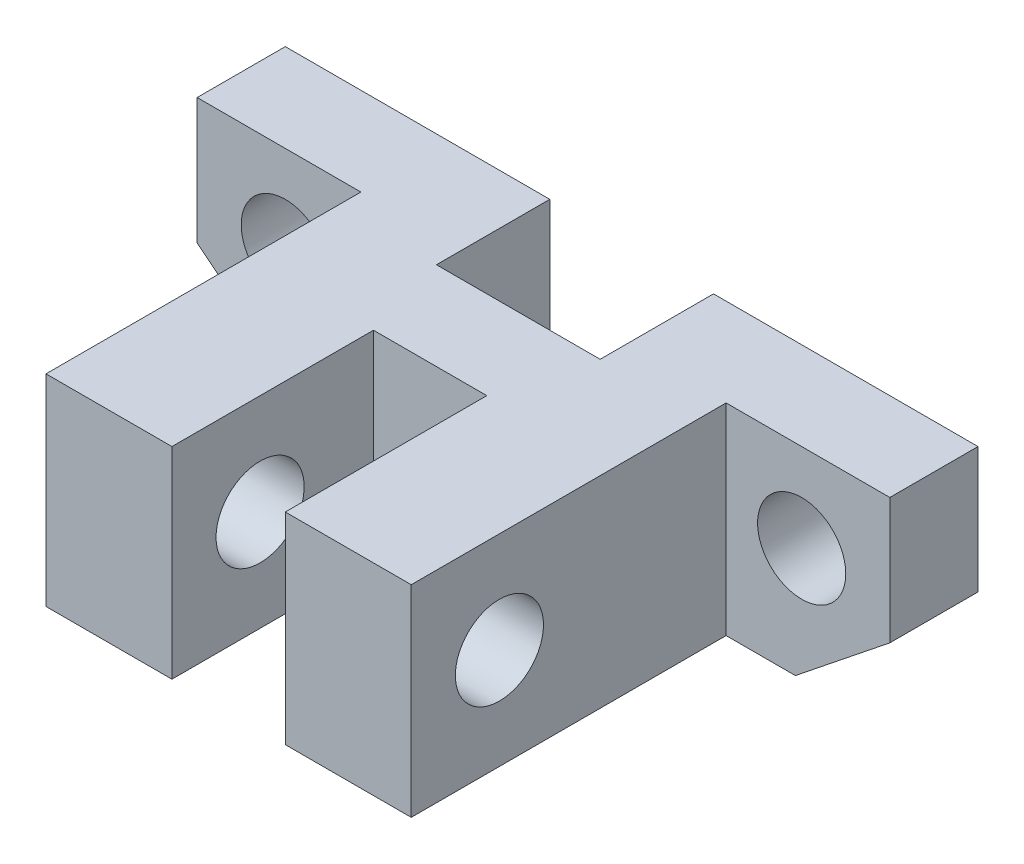
ISO-10303-21;
HEADER;
FILE_DESCRIPTION(('STEP AP214'),'2;1');
FILE_NAME('part.step','',(''),(''),'','','');
FILE_SCHEMA(('AUTOMOTIVE_DESIGN { 1 0 10303 214 1 1 1 1 }'));
ENDSEC;
DATA;
#1=APPLICATION_CONTEXT('core data for automotive mechanical design processes');
#2=APPLICATION_PROTOCOL_DEFINITION('international standard','automotive_design',2000,#1);
#3=PRODUCT_CONTEXT('',#1,'mechanical');
#4=PRODUCT('Part','Part','',(#3));
#5=PRODUCT_RELATED_PRODUCT_CATEGORY('part','',(#4));
#6=PRODUCT_DEFINITION_FORMATION('','',#4);
#7=PRODUCT_DEFINITION_CONTEXT('part definition',#1,'design');
#8=PRODUCT_DEFINITION('design','',#6,#7);
#9=PRODUCT_DEFINITION_SHAPE('','',#8);
#10=(LENGTH_UNIT() NAMED_UNIT(*) SI_UNIT(.MILLI.,.METRE.));
#11=(NAMED_UNIT(*) PLANE_ANGLE_UNIT() SI_UNIT($,.RADIAN.));
#12=(NAMED_UNIT(*) SI_UNIT($,.STERADIAN.) SOLID_ANGLE_UNIT());
#13=UNCERTAINTY_MEASURE_WITH_UNIT(LENGTH_MEASURE(1.E-05),#10,'distance_accuracy_value','');
#14=(GEOMETRIC_REPRESENTATION_CONTEXT(3) GLOBAL_UNCERTAINTY_ASSIGNED_CONTEXT((#13)) GLOBAL_UNIT_ASSIGNED_CONTEXT((#10,
#11,#12)) REPRESENTATION_CONTEXT('',''));
#15=CARTESIAN_POINT('',(0.,0.,0.));
#16=DIRECTION('',(0.,0.,1.));
#17=DIRECTION('',(1.,0.,0.));
#18=AXIS2_PLACEMENT_3D('',#15,#16,#17);
#19=CARTESIAN_POINT('',(0.,0.,32.));
#20=DIRECTION('',(0.,0.,1.));
#21=DIRECTION('',(1.,0.,0.));
#22=AXIS2_PLACEMENT_3D('',#19,#20,#21);
#23=PLANE('',#22);
#24=DIRECTION('',(0.,1.,0.));
#25=VECTOR('',#24,1.);
#26=CARTESIAN_POINT('',(4.5,0.,32.));
#27=LINE('',#26,#25);
#28=CARTESIAN_POINT('',(4.5,-11.,32.));
#29=VERTEX_POINT('',#28);
#30=CARTESIAN_POINT('',(4.5,5.,32.));
#31=VERTEX_POINT('',#30);
#32=EDGE_CURVE('E210',#29,#31,#27,.T.);
#33=ORIENTED_EDGE('',*,*,#32,.F.);
#34=DIRECTION('',(1.,0.,0.));
#35=VECTOR('',#34,1.);
#36=CARTESIAN_POINT('',(-20.,-11.,32.));
#37=LINE('',#36,#35);
#38=CARTESIAN_POINT('',(14.5,-11.,32.));
#39=VERTEX_POINT('',#38);
#40=EDGE_CURVE('E294',#29,#39,#37,.T.);
#41=ORIENTED_EDGE('',*,*,#40,.T.);
#42=DIRECTION('',(0.,1.,0.));
#43=VECTOR('',#42,1.);
#44=CARTESIAN_POINT('',(14.5,0.,32.));
#45=LINE('',#44,#43);
#46=CARTESIAN_POINT('',(14.5,5.,32.));
#47=VERTEX_POINT('',#46);
#48=EDGE_CURVE('E344',#39,#47,#45,.T.);
#49=ORIENTED_EDGE('',*,*,#48,.T.);
#50=DIRECTION('',(-1.,0.,0.));
#51=VECTOR('',#50,1.);
#52=CARTESIAN_POINT('',(-27.5,5.,32.));
#53=LINE('',#52,#51);
#54=EDGE_CURVE('E290',#47,#31,#53,.T.);
#55=ORIENTED_EDGE('',*,*,#54,.T.);
#56=EDGE_LOOP('',(#33,#41,#49,#55));
#57=FACE_BOUND('',#56,.T.);
#58=ADVANCED_FACE('F45',(#57),#23,.T.);
#59=CARTESIAN_POINT('',(0.,0.,0.));
#60=DIRECTION('',(0.,0.,1.));
#61=DIRECTION('',(1.,0.,0.));
#62=AXIS2_PLACEMENT_3D('',#59,#60,#61);
#63=PLANE('',#62);
#64=CARTESIAN_POINT('',(20.5,-2.,0.));
#65=DIRECTION('',(0.,0.,1.));
#66=DIRECTION('',(1.,0.,0.));
#67=AXIS2_PLACEMENT_3D('',#64,#65,#66);
#68=CIRCLE('',#67,3.5);
#69=CARTESIAN_POINT('',(24.,-2.,0.));
#70=VERTEX_POINT('',#69);
#71=EDGE_CURVE('E632',#70,#70,#68,.T.);
#72=ORIENTED_EDGE('',*,*,#71,.T.);
#73=EDGE_LOOP('',(#72));
#74=FACE_BOUND('',#73,.T.);
#75=DIRECTION('',(1.,0.,0.));
#76=VECTOR('',#75,1.);
#77=CARTESIAN_POINT('',(-20.,-11.,0.));
#78=LINE('',#77,#76);
#79=CARTESIAN_POINT('',(6.5,-11.,0.));
#80=VERTEX_POINT('',#79);
#81=CARTESIAN_POINT('',(20.,-11.,0.));
#82=VERTEX_POINT('',#81);
#83=EDGE_CURVE('E320',#80,#82,#78,.T.);
#84=ORIENTED_EDGE('',*,*,#83,.F.);
#85=DIRECTION('',(0.,-1.,0.));
#86=VECTOR('',#85,1.);
#87=CARTESIAN_POINT('',(6.5,5.,0.));
#88=LINE('',#87,#86);
#89=CARTESIAN_POINT('',(6.5,5.,0.));
#90=VERTEX_POINT('',#89);
#91=EDGE_CURVE('E236',#90,#80,#88,.T.);
#92=ORIENTED_EDGE('',*,*,#91,.F.);
#93=DIRECTION('',(-1.,0.,0.));
#94=VECTOR('',#93,1.);
#95=CARTESIAN_POINT('',(-27.5,5.,0.));
#96=LINE('',#95,#94);
#97=CARTESIAN_POINT('',(27.5,5.,0.));
#98=VERTEX_POINT('',#97);
#99=EDGE_CURVE('E308',#98,#90,#96,.T.);
#100=ORIENTED_EDGE('',*,*,#99,.F.);
#101=DIRECTION('',(0.,1.,0.));
#102=VECTOR('',#101,1.);
#103=CARTESIAN_POINT('',(27.5,5.,0.));
#104=LINE('',#103,#102);
#105=CARTESIAN_POINT('',(27.5,-5.,0.));
#106=VERTEX_POINT('',#105);
#107=EDGE_CURVE('E303',#106,#98,#104,.T.);
#108=ORIENTED_EDGE('',*,*,#107,.F.);
#109=DIRECTION('',(0.780868809443031,0.624695047554424,0.));
#110=VECTOR('',#109,1.);
#111=CARTESIAN_POINT('',(20.,-11.,0.));
#112=LINE('',#111,#110);
#113=EDGE_CURVE('E289',#82,#106,#112,.T.);
#114=ORIENTED_EDGE('',*,*,#113,.F.);
#115=EDGE_LOOP('',(#84,#92,#100,#108,#114));
#116=FACE_BOUND('',#115,.T.);
#117=ADVANCED_FACE('F387',(#74,#116),#63,.F.);
#118=DIRECTION('',(0.,-1.,0.));
#119=VECTOR('',#118,1.);
#120=CARTESIAN_POINT('',(-4.5,0.,32.));
#121=LINE('',#120,#119);
#122=CARTESIAN_POINT('',(-4.5,5.,32.));
#123=VERTEX_POINT('',#122);
#124=CARTESIAN_POINT('',(-4.5,-11.,32.));
#125=VERTEX_POINT('',#124);
#126=EDGE_CURVE('E62',#123,#125,#121,.T.);
#127=ORIENTED_EDGE('',*,*,#126,.F.);
#128=CARTESIAN_POINT('',(-14.5,5.,32.));
#129=VERTEX_POINT('',#128);
#130=EDGE_CURVE('E191',#123,#129,#53,.T.);
#131=ORIENTED_EDGE('',*,*,#130,.T.);
#132=DIRECTION('',(0.,-1.,0.));
#133=VECTOR('',#132,1.);
#134=CARTESIAN_POINT('',(-14.5,0.,32.));
#135=LINE('',#134,#133);
#136=CARTESIAN_POINT('',(-14.5,-11.,32.));
#137=VERTEX_POINT('',#136);
#138=EDGE_CURVE('E251',#129,#137,#135,.T.);
#139=ORIENTED_EDGE('',*,*,#138,.T.);
#140=EDGE_CURVE('E295',#137,#125,#37,.T.);
#141=ORIENTED_EDGE('',*,*,#140,.T.);
#142=EDGE_LOOP('',(#127,#131,#139,#141));
#143=FACE_BOUND('',#142,.T.);
#144=ADVANCED_FACE('F411',(#143),#23,.T.);
#145=CARTESIAN_POINT('',(20.,-11.,32.));
#146=DIRECTION('',(-0.624695047554424,0.780868809443031,0.));
#147=DIRECTION('',(-0.780868809443031,-0.624695047554424,0.));
#148=AXIS2_PLACEMENT_3D('',#145,#146,#147);
#149=PLANE('',#148);
#150=DIRECTION('',(0.,0.,-1.));
#151=VECTOR('',#150,1.);
#152=CARTESIAN_POINT('',(27.5,-5.,32.));
#153=LINE('',#152,#151);
#154=CARTESIAN_POINT('',(27.5,-5.,7.));
#155=VERTEX_POINT('',#154);
#156=EDGE_CURVE('E341',#155,#106,#153,.T.);
#157=ORIENTED_EDGE('',*,*,#156,.F.);
#158=DIRECTION('',(-0.780868809443031,-0.624695047554424,0.));
#159=VECTOR('',#158,1.);
#160=CARTESIAN_POINT('',(20.,-11.,6.99999999999999));
#161=LINE('',#160,#159);
#162=CARTESIAN_POINT('',(20.,-11.,7.));
#163=VERTEX_POINT('',#162);
#164=EDGE_CURVE('E281',#155,#163,#161,.T.);
#165=ORIENTED_EDGE('',*,*,#164,.T.);
#166=DIRECTION('',(0.,0.,-1.));
#167=VECTOR('',#166,1.);
#168=CARTESIAN_POINT('',(20.,-11.,32.));
#169=LINE('',#168,#167);
#170=EDGE_CURVE('E299',#163,#82,#169,.T.);
#171=ORIENTED_EDGE('',*,*,#170,.T.);
#172=ORIENTED_EDGE('',*,*,#113,.T.);
#173=EDGE_LOOP('',(#157,#165,#171,#172));
#174=FACE_BOUND('',#173,.T.);
#175=ADVANCED_FACE('F47',(#174),#149,.F.);
#176=CARTESIAN_POINT('',(27.5,5.,32.));
#177=DIRECTION('',(-1.,0.,0.));
#178=DIRECTION('',(0.,0.,1.));
#179=AXIS2_PLACEMENT_3D('',#176,#177,#178);
#180=PLANE('',#179);
#181=DIRECTION('',(0.,0.,-1.));
#182=VECTOR('',#181,1.);
#183=CARTESIAN_POINT('',(27.5,5.,32.));
#184=LINE('',#183,#182);
#185=CARTESIAN_POINT('',(27.5,5.,7.));
#186=VERTEX_POINT('',#185);
#187=EDGE_CURVE('E338',#186,#98,#184,.T.);
#188=ORIENTED_EDGE('',*,*,#187,.F.);
#189=DIRECTION('',(0.,1.,0.));
#190=VECTOR('',#189,1.);
#191=CARTESIAN_POINT('',(27.5,16.7277578085355,7.));
#192=LINE('',#191,#190);
#193=EDGE_CURVE('E268',#155,#186,#192,.T.);
#194=ORIENTED_EDGE('',*,*,#193,.F.);
#195=ORIENTED_EDGE('',*,*,#156,.T.);
#196=ORIENTED_EDGE('',*,*,#107,.T.);
#197=EDGE_LOOP('',(#188,#194,#195,#196));
#198=FACE_BOUND('',#197,.T.);
#199=ADVANCED_FACE('F394',(#198),#180,.F.);
#200=CARTESIAN_POINT('',(-27.5,5.,32.));
#201=DIRECTION('',(0.,-1.,0.));
#202=DIRECTION('',(0.,0.,-1.));
#203=AXIS2_PLACEMENT_3D('',#200,#201,#202);
#204=PLANE('',#203);
#205=DIRECTION('',(1.,0.,0.));
#206=VECTOR('',#205,1.);
#207=CARTESIAN_POINT('',(-4.5,5.,16.));
#208=LINE('',#207,#206);
#209=CARTESIAN_POINT('',(-4.5,5.,16.));
#210=VERTEX_POINT('',#209);
#211=CARTESIAN_POINT('',(4.5,5.,16.));
#212=VERTEX_POINT('',#211);
#213=EDGE_CURVE('E179',#210,#212,#208,.T.);
#214=ORIENTED_EDGE('',*,*,#213,.T.);
#215=DIRECTION('',(0.,0.,1.));
#216=VECTOR('',#215,1.);
#217=CARTESIAN_POINT('',(4.5,5.,16.));
#218=LINE('',#217,#216);
#219=EDGE_CURVE('E193',#212,#31,#218,.T.);
#220=ORIENTED_EDGE('',*,*,#219,.T.);
#221=ORIENTED_EDGE('',*,*,#54,.F.);
#222=DIRECTION('',(0.,0.,1.));
#223=VECTOR('',#222,1.);
#224=CARTESIAN_POINT('',(14.5,5.,32.));
#225=LINE('',#224,#223);
#226=CARTESIAN_POINT('',(14.5,5.,7.));
#227=VERTEX_POINT('',#226);
#228=EDGE_CURVE('E278',#227,#47,#225,.T.);
#229=ORIENTED_EDGE('',*,*,#228,.F.);
#230=DIRECTION('',(1.,0.,0.));
#231=VECTOR('',#230,1.);
#232=CARTESIAN_POINT('',(-27.5,5.,7.));
#233=LINE('',#232,#231);
#234=EDGE_CURVE('E285',#227,#186,#233,.T.);
#235=ORIENTED_EDGE('',*,*,#234,.T.);
#236=ORIENTED_EDGE('',*,*,#187,.T.);
#237=ORIENTED_EDGE('',*,*,#99,.T.);
#238=DIRECTION('',(0.,0.,1.));
#239=VECTOR('',#238,1.);
#240=CARTESIAN_POINT('',(6.5,5.,9.));
#241=LINE('',#240,#239);
#242=CARTESIAN_POINT('',(6.5,5.,9.));
#243=VERTEX_POINT('',#242);
#244=EDGE_CURVE('E214',#90,#243,#241,.T.);
#245=ORIENTED_EDGE('',*,*,#244,.T.);
#246=DIRECTION('',(-1.,0.,0.));
#247=VECTOR('',#246,1.);
#248=CARTESIAN_POINT('',(-6.5,5.,9.));
#249=LINE('',#248,#247);
#250=CARTESIAN_POINT('',(-6.5,5.,9.));
#251=VERTEX_POINT('',#250);
#252=EDGE_CURVE('E218',#243,#251,#249,.T.);
#253=ORIENTED_EDGE('',*,*,#252,.T.);
#254=DIRECTION('',(0.,0.,-1.));
#255=VECTOR('',#254,1.);
#256=CARTESIAN_POINT('',(-6.5,5.,9.));
#257=LINE('',#256,#255);
#258=CARTESIAN_POINT('',(-6.5,5.,0.));
#259=VERTEX_POINT('',#258);
#260=EDGE_CURVE('E222',#251,#259,#257,.T.);
#261=ORIENTED_EDGE('',*,*,#260,.T.);
#262=CARTESIAN_POINT('',(-27.5,5.,0.));
#263=VERTEX_POINT('',#262);
#264=EDGE_CURVE('E307',#259,#263,#96,.T.);
#265=ORIENTED_EDGE('',*,*,#264,.T.);
#266=DIRECTION('',(0.,0.,-1.));
#267=VECTOR('',#266,1.);
#268=CARTESIAN_POINT('',(-27.5,5.,32.));
#269=LINE('',#268,#267);
#270=CARTESIAN_POINT('',(-27.5,5.,7.));
#271=VERTEX_POINT('',#270);
#272=EDGE_CURVE('E334',#271,#263,#269,.T.);
#273=ORIENTED_EDGE('',*,*,#272,.F.);
#274=DIRECTION('',(1.,0.,0.));
#275=VECTOR('',#274,1.);
#276=CARTESIAN_POINT('',(-27.5,5.,7.));
#277=LINE('',#276,#275);
#278=CARTESIAN_POINT('',(-14.5,5.,7.));
#279=VERTEX_POINT('',#278);
#280=EDGE_CURVE('E264',#271,#279,#277,.T.);
#281=ORIENTED_EDGE('',*,*,#280,.T.);
#282=DIRECTION('',(0.,0.,-1.));
#283=VECTOR('',#282,1.);
#284=CARTESIAN_POINT('',(-14.5,5.,32.));
#285=LINE('',#284,#283);
#286=EDGE_CURVE('E257',#129,#279,#285,.T.);
#287=ORIENTED_EDGE('',*,*,#286,.F.);
#288=ORIENTED_EDGE('',*,*,#130,.F.);
#289=DIRECTION('',(0.,0.,-1.));
#290=VECTOR('',#289,1.);
#291=CARTESIAN_POINT('',(-4.5,5.,16.));
#292=LINE('',#291,#290);
#293=EDGE_CURVE('E173',#123,#210,#292,.T.);
#294=ORIENTED_EDGE('',*,*,#293,.T.);
#295=EDGE_LOOP('',(#214,#220,#221,#229,#235,#236,#237,#245,#253,#261,#265,#273,#281,#287,#288,#294));
#296=FACE_BOUND('',#295,.T.);
#297=ADVANCED_FACE('F189',(#296),#204,.F.);
#298=CARTESIAN_POINT('',(-27.5,5.,32.));
#299=DIRECTION('',(1.,0.,0.));
#300=DIRECTION('',(0.,0.,-1.));
#301=AXIS2_PLACEMENT_3D('',#298,#299,#300);
#302=PLANE('',#301);
#303=DIRECTION('',(0.,0.,-1.));
#304=VECTOR('',#303,1.);
#305=CARTESIAN_POINT('',(-27.5,-5.,32.));
#306=LINE('',#305,#304);
#307=CARTESIAN_POINT('',(-27.5,-5.,7.));
#308=VERTEX_POINT('',#307);
#309=CARTESIAN_POINT('',(-27.5,-5.,0.));
#310=VERTEX_POINT('',#309);
#311=EDGE_CURVE('E331',#308,#310,#306,.T.);
#312=ORIENTED_EDGE('',*,*,#311,.F.);
#313=DIRECTION('',(0.,-1.,0.));
#314=VECTOR('',#313,1.);
#315=CARTESIAN_POINT('',(-27.5,10.7920474144833,7.));
#316=LINE('',#315,#314);
#317=EDGE_CURVE('E239',#271,#308,#316,.T.);
#318=ORIENTED_EDGE('',*,*,#317,.F.);
#319=ORIENTED_EDGE('',*,*,#272,.T.);
#320=DIRECTION('',(0.,-1.,0.));
#321=VECTOR('',#320,1.);
#322=CARTESIAN_POINT('',(-27.5,5.,0.));
#323=LINE('',#322,#321);
#324=EDGE_CURVE('E312',#263,#310,#323,.T.);
#325=ORIENTED_EDGE('',*,*,#324,.T.);
#326=EDGE_LOOP('',(#312,#318,#319,#325));
#327=FACE_BOUND('',#326,.T.);
#328=ADVANCED_FACE('F405',(#327),#302,.F.);
#329=CARTESIAN_POINT('',(-20.,-11.,32.));
#330=DIRECTION('',(0.624695047554424,0.78086880944303,0.));
#331=DIRECTION('',(-0.78086880944303,0.624695047554424,0.));
#332=AXIS2_PLACEMENT_3D('',#329,#330,#331);
#333=PLANE('',#332);
#334=DIRECTION('',(0.,0.,-1.));
#335=VECTOR('',#334,1.);
#336=CARTESIAN_POINT('',(-20.,-11.,32.));
#337=LINE('',#336,#335);
#338=CARTESIAN_POINT('',(-20.,-11.,7.));
#339=VERTEX_POINT('',#338);
#340=CARTESIAN_POINT('',(-20.,-11.,0.));
#341=VERTEX_POINT('',#340);
#342=EDGE_CURVE('E328',#339,#341,#337,.T.);
#343=ORIENTED_EDGE('',*,*,#342,.F.);
#344=DIRECTION('',(-0.78086880944303,0.624695047554424,0.));
#345=VECTOR('',#344,1.);
#346=CARTESIAN_POINT('',(-20.,-11.,7.));
#347=LINE('',#346,#345);
#348=EDGE_CURVE('E260',#339,#308,#347,.T.);
#349=ORIENTED_EDGE('',*,*,#348,.T.);
#350=ORIENTED_EDGE('',*,*,#311,.T.);
#351=DIRECTION('',(0.78086880944303,-0.624695047554424,0.));
#352=VECTOR('',#351,1.);
#353=CARTESIAN_POINT('',(-20.,-11.,0.));
#354=LINE('',#353,#352);
#355=EDGE_CURVE('E316',#310,#341,#354,.T.);
#356=ORIENTED_EDGE('',*,*,#355,.T.);
#357=EDGE_LOOP('',(#343,#349,#350,#356));
#358=FACE_BOUND('',#357,.T.);
#359=ADVANCED_FACE('F367',(#358),#333,.F.);
#360=CARTESIAN_POINT('',(-20.,-11.,32.));
#361=DIRECTION('',(0.,1.,0.));
#362=DIRECTION('',(0.,0.,1.));
#363=AXIS2_PLACEMENT_3D('',#360,#361,#362);
#364=PLANE('',#363);
#365=ORIENTED_EDGE('',*,*,#40,.F.);
#366=DIRECTION('',(0.,0.,1.));
#367=VECTOR('',#366,1.);
#368=CARTESIAN_POINT('',(4.5,-11.,16.));
#369=LINE('',#368,#367);
#370=CARTESIAN_POINT('',(4.5,-11.,16.));
#371=VERTEX_POINT('',#370);
#372=EDGE_CURVE('E200',#371,#29,#369,.T.);
#373=ORIENTED_EDGE('',*,*,#372,.F.);
#374=DIRECTION('',(1.,0.,0.));
#375=VECTOR('',#374,1.);
#376=CARTESIAN_POINT('',(-4.5,-11.,16.));
#377=LINE('',#376,#375);
#378=CARTESIAN_POINT('',(-4.5,-11.,16.));
#379=VERTEX_POINT('',#378);
#380=EDGE_CURVE('E196',#379,#371,#377,.T.);
#381=ORIENTED_EDGE('',*,*,#380,.F.);
#382=DIRECTION('',(0.,0.,1.));
#383=VECTOR('',#382,1.);
#384=CARTESIAN_POINT('',(-4.5,-11.,32.));
#385=LINE('',#384,#383);
#386=EDGE_CURVE('E11',#379,#125,#385,.T.);
#387=ORIENTED_EDGE('',*,*,#386,.T.);
#388=ORIENTED_EDGE('',*,*,#140,.F.);
#389=DIRECTION('',(0.,0.,1.));
#390=VECTOR('',#389,1.);
#391=CARTESIAN_POINT('',(-14.5,-11.,32.));
#392=LINE('',#391,#390);
#393=CARTESIAN_POINT('',(-14.5,-11.,7.));
#394=VERTEX_POINT('',#393);
#395=EDGE_CURVE('E352',#394,#137,#392,.T.);
#396=ORIENTED_EDGE('',*,*,#395,.F.);
#397=DIRECTION('',(-1.,0.,0.));
#398=VECTOR('',#397,1.);
#399=CARTESIAN_POINT('',(-20.,-11.,7.));
#400=LINE('',#399,#398);
#401=EDGE_CURVE('E55',#394,#339,#400,.T.);
#402=ORIENTED_EDGE('',*,*,#401,.T.);
#403=ORIENTED_EDGE('',*,*,#342,.T.);
#404=CARTESIAN_POINT('',(-6.5,-11.,0.));
#405=VERTEX_POINT('',#404);
#406=EDGE_CURVE('E321',#341,#405,#78,.T.);
#407=ORIENTED_EDGE('',*,*,#406,.T.);
#408=DIRECTION('',(0.,0.,-1.));
#409=VECTOR('',#408,1.);
#410=CARTESIAN_POINT('',(-6.5,-11.,9.));
#411=LINE('',#410,#409);
#412=CARTESIAN_POINT('',(-6.5,-11.,9.));
#413=VERTEX_POINT('',#412);
#414=EDGE_CURVE('E69',#413,#405,#411,.T.);
#415=ORIENTED_EDGE('',*,*,#414,.F.);
#416=DIRECTION('',(-1.,0.,0.));
#417=VECTOR('',#416,1.);
#418=CARTESIAN_POINT('',(-6.5,-11.,9.));
#419=LINE('',#418,#417);
#420=CARTESIAN_POINT('',(6.5,-11.,9.));
#421=VERTEX_POINT('',#420);
#422=EDGE_CURVE('E230',#421,#413,#419,.T.);
#423=ORIENTED_EDGE('',*,*,#422,.F.);
#424=DIRECTION('',(0.,0.,1.));
#425=VECTOR('',#424,1.);
#426=CARTESIAN_POINT('',(6.5,-11.,9.));
#427=LINE('',#426,#425);
#428=EDGE_CURVE('E213',#80,#421,#427,.T.);
#429=ORIENTED_EDGE('',*,*,#428,.F.);
#430=ORIENTED_EDGE('',*,*,#83,.T.);
#431=ORIENTED_EDGE('',*,*,#170,.F.);
#432=DIRECTION('',(-1.,0.,0.));
#433=VECTOR('',#432,1.);
#434=CARTESIAN_POINT('',(-20.,-11.,7.));
#435=LINE('',#434,#433);
#436=CARTESIAN_POINT('',(14.5,-11.,7.));
#437=VERTEX_POINT('',#436);
#438=EDGE_CURVE('E348',#163,#437,#435,.T.);
#439=ORIENTED_EDGE('',*,*,#438,.T.);
#440=DIRECTION('',(0.,0.,-1.));
#441=VECTOR('',#440,1.);
#442=CARTESIAN_POINT('',(14.5,-11.,32.));
#443=LINE('',#442,#441);
#444=EDGE_CURVE('E273',#39,#437,#443,.T.);
#445=ORIENTED_EDGE('',*,*,#444,.F.);
#446=EDGE_LOOP('',(#365,#373,#381,#387,#388,#396,#402,#403,#407,#415,#423,#429,#430,#431,#439,#445));
#447=FACE_BOUND('',#446,.T.);
#448=ADVANCED_FACE('F362',(#447),#364,.F.);
#449=CARTESIAN_POINT('',(-20.5,-2.,0.));
#450=DIRECTION('',(0.,0.,1.));
#451=DIRECTION('',(1.,0.,0.));
#452=AXIS2_PLACEMENT_3D('',#449,#450,#451);
#453=CIRCLE('',#452,3.5);
#454=CARTESIAN_POINT('',(-17.,-2.,0.));
#455=VERTEX_POINT('',#454);
#456=EDGE_CURVE('E643',#455,#455,#453,.T.);
#457=ORIENTED_EDGE('',*,*,#456,.T.);
#458=EDGE_LOOP('',(#457));
#459=FACE_BOUND('',#458,.T.);
#460=ORIENTED_EDGE('',*,*,#264,.F.);
#461=DIRECTION('',(0.,-1.,0.));
#462=VECTOR('',#461,1.);
#463=CARTESIAN_POINT('',(-6.5,5.,0.));
#464=LINE('',#463,#462);
#465=EDGE_CURVE('E240',#259,#405,#464,.T.);
#466=ORIENTED_EDGE('',*,*,#465,.T.);
#467=ORIENTED_EDGE('',*,*,#406,.F.);
#468=ORIENTED_EDGE('',*,*,#355,.F.);
#469=ORIENTED_EDGE('',*,*,#324,.F.);
#470=EDGE_LOOP('',(#460,#466,#467,#468,#469));
#471=FACE_BOUND('',#470,.T.);
#472=ADVANCED_FACE('F374',(#459,#471),#63,.F.);
#473=CARTESIAN_POINT('',(14.5,16.7277578085355,7.));
#474=DIRECTION('',(0.,0.,-1.));
#475=DIRECTION('',(0.,1.,0.));
#476=AXIS2_PLACEMENT_3D('',#473,#474,#475);
#477=PLANE('',#476);
#478=CARTESIAN_POINT('',(20.5,-2.,7.));
#479=DIRECTION('',(0.,0.,1.));
#480=DIRECTION('',(1.,0.,0.));
#481=AXIS2_PLACEMENT_3D('',#478,#479,#480);
#482=CIRCLE('',#481,3.5);
#483=CARTESIAN_POINT('',(24.,-2.,7.));
#484=VERTEX_POINT('',#483);
#485=EDGE_CURVE('E634',#484,#484,#482,.T.);
#486=ORIENTED_EDGE('',*,*,#485,.F.);
#487=EDGE_LOOP('',(#486));
#488=FACE_BOUND('',#487,.T.);
#489=DIRECTION('',(0.,1.,0.));
#490=VECTOR('',#489,1.);
#491=CARTESIAN_POINT('',(14.5,16.7277578085355,7.));
#492=LINE('',#491,#490);
#493=EDGE_CURVE('E269',#437,#227,#492,.T.);
#494=ORIENTED_EDGE('',*,*,#493,.F.);
#495=ORIENTED_EDGE('',*,*,#438,.F.);
#496=ORIENTED_EDGE('',*,*,#164,.F.);
#497=ORIENTED_EDGE('',*,*,#193,.T.);
#498=ORIENTED_EDGE('',*,*,#234,.F.);
#499=EDGE_LOOP('',(#494,#495,#496,#497,#498));
#500=FACE_BOUND('',#499,.T.);
#501=ADVANCED_FACE('F423',(#488,#500),#477,.F.);
#502=CARTESIAN_POINT('',(14.5,0.,0.));
#503=DIRECTION('',(1.,0.,0.));
#504=DIRECTION('',(0.,0.,-1.));
#505=AXIS2_PLACEMENT_3D('',#502,#503,#504);
#506=PLANE('',#505);
#507=CARTESIAN_POINT('',(14.5,-3.,25.));
#508=DIRECTION('',(1.,0.,0.));
#509=DIRECTION('',(0.,0.,-1.));
#510=AXIS2_PLACEMENT_3D('',#507,#508,#509);
#511=CIRCLE('',#510,3.5);
#512=CARTESIAN_POINT('',(14.5,-3.,21.5));
#513=VERTEX_POINT('',#512);
#514=EDGE_CURVE('E640',#513,#513,#511,.T.);
#515=ORIENTED_EDGE('',*,*,#514,.F.);
#516=EDGE_LOOP('',(#515));
#517=FACE_BOUND('',#516,.T.);
#518=ORIENTED_EDGE('',*,*,#228,.T.);
#519=ORIENTED_EDGE('',*,*,#48,.F.);
#520=ORIENTED_EDGE('',*,*,#444,.T.);
#521=ORIENTED_EDGE('',*,*,#493,.T.);
#522=EDGE_LOOP('',(#518,#519,#520,#521));
#523=FACE_BOUND('',#522,.T.);
#524=ADVANCED_FACE('F420',(#517,#523),#506,.T.);
#525=CARTESIAN_POINT('',(-14.5,10.7920474144833,7.));
#526=DIRECTION('',(0.,0.,-1.));
#527=DIRECTION('',(0.,1.,0.));
#528=AXIS2_PLACEMENT_3D('',#525,#526,#527);
#529=PLANE('',#528);
#530=CARTESIAN_POINT('',(-20.5,-2.,7.));
#531=DIRECTION('',(0.,0.,1.));
#532=DIRECTION('',(1.,0.,0.));
#533=AXIS2_PLACEMENT_3D('',#530,#531,#532);
#534=CIRCLE('',#533,3.5);
#535=CARTESIAN_POINT('',(-17.,-2.,7.));
#536=VERTEX_POINT('',#535);
#537=EDGE_CURVE('E636',#536,#536,#534,.T.);
#538=ORIENTED_EDGE('',*,*,#537,.F.);
#539=EDGE_LOOP('',(#538));
#540=FACE_BOUND('',#539,.T.);
#541=ORIENTED_EDGE('',*,*,#317,.T.);
#542=ORIENTED_EDGE('',*,*,#348,.F.);
#543=ORIENTED_EDGE('',*,*,#401,.F.);
#544=DIRECTION('',(0.,-1.,0.));
#545=VECTOR('',#544,1.);
#546=CARTESIAN_POINT('',(-14.5,10.7920474144833,7.));
#547=LINE('',#546,#545);
#548=EDGE_CURVE('E248',#279,#394,#547,.T.);
#549=ORIENTED_EDGE('',*,*,#548,.F.);
#550=ORIENTED_EDGE('',*,*,#280,.F.);
#551=EDGE_LOOP('',(#541,#542,#543,#549,#550));
#552=FACE_BOUND('',#551,.T.);
#553=ADVANCED_FACE('F406',(#540,#552),#529,.F.);
#554=CARTESIAN_POINT('',(-14.5,0.,0.));
#555=DIRECTION('',(-1.,0.,0.));
#556=DIRECTION('',(0.,0.,1.));
#557=AXIS2_PLACEMENT_3D('',#554,#555,#556);
#558=PLANE('',#557);
#559=CARTESIAN_POINT('',(-14.5,-3.,25.));
#560=DIRECTION('',(-1.,0.,0.));
#561=DIRECTION('',(0.,0.,1.));
#562=AXIS2_PLACEMENT_3D('',#559,#560,#561);
#563=CIRCLE('',#562,3.5);
#564=CARTESIAN_POINT('',(-14.5,-3.,28.5));
#565=VERTEX_POINT('',#564);
#566=EDGE_CURVE('E203',#565,#565,#563,.T.);
#567=ORIENTED_EDGE('',*,*,#566,.F.);
#568=EDGE_LOOP('',(#567));
#569=FACE_BOUND('',#568,.T.);
#570=ORIENTED_EDGE('',*,*,#286,.T.);
#571=ORIENTED_EDGE('',*,*,#548,.T.);
#572=ORIENTED_EDGE('',*,*,#395,.T.);
#573=ORIENTED_EDGE('',*,*,#138,.F.);
#574=EDGE_LOOP('',(#570,#571,#572,#573));
#575=FACE_BOUND('',#574,.T.);
#576=ADVANCED_FACE('F409',(#569,#575),#558,.T.);
#577=CARTESIAN_POINT('',(6.5,5.,9.));
#578=DIRECTION('',(1.,0.,0.));
#579=DIRECTION('',(0.,0.,-1.));
#580=AXIS2_PLACEMENT_3D('',#577,#578,#579);
#581=PLANE('',#580);
#582=ORIENTED_EDGE('',*,*,#428,.T.);
#583=DIRECTION('',(0.,-1.,0.));
#584=VECTOR('',#583,1.);
#585=CARTESIAN_POINT('',(6.5,5.,9.));
#586=LINE('',#585,#584);
#587=EDGE_CURVE('E226',#243,#421,#586,.T.);
#588=ORIENTED_EDGE('',*,*,#587,.F.);
#589=ORIENTED_EDGE('',*,*,#244,.F.);
#590=ORIENTED_EDGE('',*,*,#91,.T.);
#591=EDGE_LOOP('',(#582,#588,#589,#590));
#592=FACE_BOUND('',#591,.T.);
#593=ADVANCED_FACE('F383',(#592),#581,.F.);
#594=CARTESIAN_POINT('',(-6.5,5.,9.));
#595=DIRECTION('',(-1.,0.,0.));
#596=DIRECTION('',(0.,0.,1.));
#597=AXIS2_PLACEMENT_3D('',#594,#595,#596);
#598=PLANE('',#597);
#599=ORIENTED_EDGE('',*,*,#414,.T.);
#600=ORIENTED_EDGE('',*,*,#465,.F.);
#601=ORIENTED_EDGE('',*,*,#260,.F.);
#602=DIRECTION('',(0.,-1.,0.));
#603=VECTOR('',#602,1.);
#604=CARTESIAN_POINT('',(-6.5,5.,9.));
#605=LINE('',#604,#603);
#606=EDGE_CURVE('E243',#251,#413,#605,.T.);
#607=ORIENTED_EDGE('',*,*,#606,.T.);
#608=EDGE_LOOP('',(#599,#600,#601,#607));
#609=FACE_BOUND('',#608,.T.);
#610=ADVANCED_FACE('F584',(#609),#598,.F.);
#611=CARTESIAN_POINT('',(-6.5,5.,9.));
#612=DIRECTION('',(0.,0.,1.));
#613=DIRECTION('',(1.,0.,0.));
#614=AXIS2_PLACEMENT_3D('',#611,#612,#613);
#615=PLANE('',#614);
#616=ORIENTED_EDGE('',*,*,#422,.T.);
#617=ORIENTED_EDGE('',*,*,#606,.F.);
#618=ORIENTED_EDGE('',*,*,#252,.F.);
#619=ORIENTED_EDGE('',*,*,#587,.T.);
#620=EDGE_LOOP('',(#616,#617,#618,#619));
#621=FACE_BOUND('',#620,.T.);
#622=ADVANCED_FACE('F379',(#621),#615,.F.);
#623=CARTESIAN_POINT('',(4.5,5.,16.));
#624=DIRECTION('',(1.,0.,0.));
#625=DIRECTION('',(0.,0.,-1.));
#626=AXIS2_PLACEMENT_3D('',#623,#624,#625);
#627=PLANE('',#626);
#628=CARTESIAN_POINT('',(4.5,-3.,25.));
#629=DIRECTION('',(1.,0.,0.));
#630=DIRECTION('',(0.,0.,-1.));
#631=AXIS2_PLACEMENT_3D('',#628,#629,#630);
#632=CIRCLE('',#631,3.5);
#633=CARTESIAN_POINT('',(4.5,-3.,21.5));
#634=VERTEX_POINT('',#633);
#635=EDGE_CURVE('E652',#634,#634,#632,.T.);
#636=ORIENTED_EDGE('',*,*,#635,.T.);
#637=EDGE_LOOP('',(#636));
#638=FACE_BOUND('',#637,.T.);
#639=ORIENTED_EDGE('',*,*,#32,.T.);
#640=ORIENTED_EDGE('',*,*,#219,.F.);
#641=DIRECTION('',(0.,-1.,0.));
#642=VECTOR('',#641,1.);
#643=CARTESIAN_POINT('',(4.5,5.,16.));
#644=LINE('',#643,#642);
#645=EDGE_CURVE('E178',#212,#371,#644,.T.);
#646=ORIENTED_EDGE('',*,*,#645,.T.);
#647=ORIENTED_EDGE('',*,*,#372,.T.);
#648=EDGE_LOOP('',(#639,#640,#646,#647));
#649=FACE_BOUND('',#648,.T.);
#650=ADVANCED_FACE('F415',(#638,#649),#627,.F.);
#651=CARTESIAN_POINT('',(-4.5,5.,16.));
#652=DIRECTION('',(0.,0.,-1.));
#653=DIRECTION('',(-1.,0.,0.));
#654=AXIS2_PLACEMENT_3D('',#651,#652,#653);
#655=PLANE('',#654);
#656=ORIENTED_EDGE('',*,*,#380,.T.);
#657=ORIENTED_EDGE('',*,*,#645,.F.);
#658=ORIENTED_EDGE('',*,*,#213,.F.);
#659=DIRECTION('',(0.,-1.,0.));
#660=VECTOR('',#659,1.);
#661=CARTESIAN_POINT('',(-4.5,5.,16.));
#662=LINE('',#661,#660);
#663=EDGE_CURVE('E169',#210,#379,#662,.T.);
#664=ORIENTED_EDGE('',*,*,#663,.T.);
#665=EDGE_LOOP('',(#656,#657,#658,#664));
#666=FACE_BOUND('',#665,.T.);
#667=ADVANCED_FACE('F182',(#666),#655,.F.);
#668=CARTESIAN_POINT('',(-4.5,5.,16.));
#669=DIRECTION('',(-1.,0.,0.));
#670=DIRECTION('',(0.,0.,1.));
#671=AXIS2_PLACEMENT_3D('',#668,#669,#670);
#672=PLANE('',#671);
#673=CARTESIAN_POINT('',(-4.5,-3.,25.));
#674=DIRECTION('',(-1.,0.,0.));
#675=DIRECTION('',(0.,0.,1.));
#676=AXIS2_PLACEMENT_3D('',#673,#674,#675);
#677=CIRCLE('',#676,3.5);
#678=CARTESIAN_POINT('',(-4.5,-3.,28.5));
#679=VERTEX_POINT('',#678);
#680=EDGE_CURVE('E49',#679,#679,#677,.T.);
#681=ORIENTED_EDGE('',*,*,#680,.T.);
#682=EDGE_LOOP('',(#681));
#683=FACE_BOUND('',#682,.T.);
#684=ORIENTED_EDGE('',*,*,#126,.T.);
#685=ORIENTED_EDGE('',*,*,#386,.F.);
#686=ORIENTED_EDGE('',*,*,#663,.F.);
#687=ORIENTED_EDGE('',*,*,#293,.F.);
#688=EDGE_LOOP('',(#684,#685,#686,#687));
#689=FACE_BOUND('',#688,.T.);
#690=ADVANCED_FACE('F171',(#683,#689),#672,.F.);
#691=CARTESIAN_POINT('',(-27.5,-3.,25.));
#692=DIRECTION('',(1.,0.,0.));
#693=DIRECTION('',(0.,0.,-1.));
#694=AXIS2_PLACEMENT_3D('',#691,#692,#693);
#695=CYLINDRICAL_SURFACE('',#694,3.5);
#696=ORIENTED_EDGE('',*,*,#566,.T.);
#697=EDGE_LOOP('',(#696));
#698=FACE_BOUND('',#697,.T.);
#699=ORIENTED_EDGE('',*,*,#680,.F.);
#700=EDGE_LOOP('',(#699));
#701=FACE_BOUND('',#700,.T.);
#702=ADVANCED_FACE('F505',(#698,#701),#695,.F.);
#703=ORIENTED_EDGE('',*,*,#514,.T.);
#704=EDGE_LOOP('',(#703));
#705=FACE_BOUND('',#704,.T.);
#706=ORIENTED_EDGE('',*,*,#635,.F.);
#707=EDGE_LOOP('',(#706));
#708=FACE_BOUND('',#707,.T.);
#709=ADVANCED_FACE('F514',(#705,#708),#695,.F.);
#710=CARTESIAN_POINT('',(-20.5,-2.,0.));
#711=DIRECTION('',(0.,0.,1.));
#712=DIRECTION('',(1.,0.,0.));
#713=AXIS2_PLACEMENT_3D('',#710,#711,#712);
#714=CYLINDRICAL_SURFACE('',#713,3.5);
#715=CARTESIAN_POINT('',(-17.,-2.,0.));
#716=CARTESIAN_POINT('',(-17.,-2.,0.0729166666666667));
#717=CARTESIAN_POINT('',(-17.,-2.,0.145833333333333));
#718=CARTESIAN_POINT('',(-17.,-2.,0.291666666666667));
#719=CARTESIAN_POINT('',(-17.,-2.,0.364583333333333));
#720=CARTESIAN_POINT('',(-17.,-2.,0.510416666666667));
#721=CARTESIAN_POINT('',(-17.,-2.,0.583333333333333));
#722=CARTESIAN_POINT('',(-17.,-2.,0.729166666666667));
#723=CARTESIAN_POINT('',(-17.,-2.,0.802083333333333));
#724=CARTESIAN_POINT('',(-17.,-2.,0.947916666666666));
#725=CARTESIAN_POINT('',(-17.,-2.,1.02083333333333));
#726=CARTESIAN_POINT('',(-17.,-2.,1.16666666666667));
#727=CARTESIAN_POINT('',(-17.,-2.,1.23958333333333));
#728=CARTESIAN_POINT('',(-17.,-2.,1.38541666666667));
#729=CARTESIAN_POINT('',(-17.,-2.,1.45833333333333));
#730=CARTESIAN_POINT('',(-17.,-2.,1.60416666666667));
#731=CARTESIAN_POINT('',(-17.,-2.,1.67708333333333));
#732=CARTESIAN_POINT('',(-17.,-2.,1.82291666666667));
#733=CARTESIAN_POINT('',(-17.,-2.,1.89583333333333));
#734=CARTESIAN_POINT('',(-17.,-2.,2.04166666666667));
#735=CARTESIAN_POINT('',(-17.,-2.,2.11458333333333));
#736=CARTESIAN_POINT('',(-17.,-2.,2.26041666666667));
#737=CARTESIAN_POINT('',(-17.,-2.,2.33333333333333));
#738=CARTESIAN_POINT('',(-17.,-2.,2.47916666666667));
#739=CARTESIAN_POINT('',(-17.,-2.,2.55208333333333));
#740=CARTESIAN_POINT('',(-17.,-2.,2.69791666666667));
#741=CARTESIAN_POINT('',(-17.,-2.,2.77083333333333));
#742=CARTESIAN_POINT('',(-17.,-2.,2.91666666666667));
#743=CARTESIAN_POINT('',(-17.,-2.,2.98958333333333));
#744=CARTESIAN_POINT('',(-17.,-2.,3.13541666666667));
#745=CARTESIAN_POINT('',(-17.,-2.,3.20833333333333));
#746=CARTESIAN_POINT('',(-17.,-2.,3.35416666666667));
#747=CARTESIAN_POINT('',(-17.,-2.,3.42708333333333));
#748=CARTESIAN_POINT('',(-17.,-2.,3.57291666666667));
#749=CARTESIAN_POINT('',(-17.,-2.,3.64583333333333));
#750=CARTESIAN_POINT('',(-17.,-2.,3.79166666666667));
#751=CARTESIAN_POINT('',(-17.,-2.,3.86458333333333));
#752=CARTESIAN_POINT('',(-17.,-2.,4.01041666666667));
#753=CARTESIAN_POINT('',(-17.,-2.,4.08333333333333));
#754=CARTESIAN_POINT('',(-17.,-2.,4.22916666666667));
#755=CARTESIAN_POINT('',(-17.,-2.,4.30208333333333));
#756=CARTESIAN_POINT('',(-17.,-2.,4.44791666666667));
#757=CARTESIAN_POINT('',(-17.,-2.,4.52083333333333));
#758=CARTESIAN_POINT('',(-17.,-2.,4.66666666666667));
#759=CARTESIAN_POINT('',(-17.,-2.,4.73958333333333));
#760=CARTESIAN_POINT('',(-17.,-2.,4.88541666666666));
#761=CARTESIAN_POINT('',(-17.,-2.,4.95833333333333));
#762=CARTESIAN_POINT('',(-17.,-2.,5.10416666666667));
#763=CARTESIAN_POINT('',(-17.,-2.,5.17708333333333));
#764=CARTESIAN_POINT('',(-17.,-2.,5.32291666666667));
#765=CARTESIAN_POINT('',(-17.,-2.,5.39583333333333));
#766=CARTESIAN_POINT('',(-17.,-2.,5.54166666666667));
#767=CARTESIAN_POINT('',(-17.,-2.,5.61458333333333));
#768=CARTESIAN_POINT('',(-17.,-2.,5.76041666666667));
#769=CARTESIAN_POINT('',(-17.,-2.,5.83333333333333));
#770=CARTESIAN_POINT('',(-17.,-2.,5.97916666666667));
#771=CARTESIAN_POINT('',(-17.,-2.,6.05208333333333));
#772=CARTESIAN_POINT('',(-17.,-2.,6.19791666666667));
#773=CARTESIAN_POINT('',(-17.,-2.,6.27083333333333));
#774=CARTESIAN_POINT('',(-17.,-2.,6.41666666666667));
#775=CARTESIAN_POINT('',(-17.,-2.,6.48958333333333));
#776=CARTESIAN_POINT('',(-17.,-2.,6.63541666666666));
#777=CARTESIAN_POINT('',(-17.,-2.,6.70833333333333));
#778=CARTESIAN_POINT('',(-17.,-2.,6.85416666666666));
#779=CARTESIAN_POINT('',(-17.,-2.,6.92708333333333));
#780=CARTESIAN_POINT('',(-17.,-2.,7.));
#781=B_SPLINE_CURVE_WITH_KNOTS('',3,(#715,#716,#717,#718,#719,#720,#721,#722,#723,#724,#725,
#726,#727,#728,#729,#730,#731,#732,#733,#734,#735,#736,#737,#738,#739,#740,#741,#742,#743,#744,
#745,#746,#747,#748,#749,#750,#751,#752,#753,#754,#755,#756,#757,#758,#759,#760,#761,#762,#763,
#764,#765,#766,#767,#768,#769,#770,#771,#772,#773,#774,#775,#776,#777,#778,#779,#780),
.UNSPECIFIED.,.F.,.F.,(4,2,2,2,2,2,2,2,2,2,2,2,2,2,2,2,2,2,2,2,2,2,2,2,2,2,2,2,2,2,2,2,4),(0.,
0.21875,0.4375,0.65625,0.875,1.09375,1.3125,1.53125,1.75,1.96875,2.1875,2.40625,2.625,2.84375,
3.0625,3.28125,3.5,3.71875,3.9375,4.15625,4.375,4.59375,4.8125,5.03125,5.25,5.46875,5.6875,
5.90625,6.125,6.34375,6.5625,6.78125,7.),.UNSPECIFIED.);
#782=EDGE_CURVE('BSEAM522',#455,#536,#781,.T.);
#783=ORIENTED_EDGE('',*,*,#456,.F.);
#784=ORIENTED_EDGE('',*,*,#537,.T.);
#785=ORIENTED_EDGE('',*,*,#782,.T.);
#786=ORIENTED_EDGE('',*,*,#782,.F.);
#787=EDGE_LOOP('',(#783,#785,#784,#786));
#788=FACE_BOUND('',#787,.T.);
#789=ADVANCED_FACE('F522',(#788),#714,.F.);
#790=CARTESIAN_POINT('',(20.5,-2.,0.));
#791=DIRECTION('',(0.,0.,1.));
#792=DIRECTION('',(1.,0.,0.));
#793=AXIS2_PLACEMENT_3D('',#790,#791,#792);
#794=CYLINDRICAL_SURFACE('',#793,3.5);
#795=CARTESIAN_POINT('',(24.,-2.,0.));
#796=CARTESIAN_POINT('',(24.,-2.,0.0729166666666667));
#797=CARTESIAN_POINT('',(24.,-2.,0.145833333333333));
#798=CARTESIAN_POINT('',(24.,-2.,0.291666666666667));
#799=CARTESIAN_POINT('',(24.,-2.,0.364583333333333));
#800=CARTESIAN_POINT('',(24.,-2.,0.510416666666667));
#801=CARTESIAN_POINT('',(24.,-2.,0.583333333333333));
#802=CARTESIAN_POINT('',(24.,-2.,0.729166666666667));
#803=CARTESIAN_POINT('',(24.,-2.,0.802083333333333));
#804=CARTESIAN_POINT('',(24.,-2.,0.947916666666666));
#805=CARTESIAN_POINT('',(24.,-2.,1.02083333333333));
#806=CARTESIAN_POINT('',(24.,-2.,1.16666666666667));
#807=CARTESIAN_POINT('',(24.,-2.,1.23958333333333));
#808=CARTESIAN_POINT('',(24.,-2.,1.38541666666667));
#809=CARTESIAN_POINT('',(24.,-2.,1.45833333333333));
#810=CARTESIAN_POINT('',(24.,-2.,1.60416666666667));
#811=CARTESIAN_POINT('',(24.,-2.,1.67708333333333));
#812=CARTESIAN_POINT('',(24.,-2.,1.82291666666667));
#813=CARTESIAN_POINT('',(24.,-2.,1.89583333333333));
#814=CARTESIAN_POINT('',(24.,-2.,2.04166666666667));
#815=CARTESIAN_POINT('',(24.,-2.,2.11458333333333));
#816=CARTESIAN_POINT('',(24.,-2.,2.26041666666667));
#817=CARTESIAN_POINT('',(24.,-2.,2.33333333333333));
#818=CARTESIAN_POINT('',(24.,-2.,2.47916666666667));
#819=CARTESIAN_POINT('',(24.,-2.,2.55208333333333));
#820=CARTESIAN_POINT('',(24.,-2.,2.69791666666667));
#821=CARTESIAN_POINT('',(24.,-2.,2.77083333333333));
#822=CARTESIAN_POINT('',(24.,-2.,2.91666666666667));
#823=CARTESIAN_POINT('',(24.,-2.,2.98958333333333));
#824=CARTESIAN_POINT('',(24.,-2.,3.13541666666667));
#825=CARTESIAN_POINT('',(24.,-2.,3.20833333333333));
#826=CARTESIAN_POINT('',(24.,-2.,3.35416666666667));
#827=CARTESIAN_POINT('',(24.,-2.,3.42708333333333));
#828=CARTESIAN_POINT('',(24.,-2.,3.57291666666667));
#829=CARTESIAN_POINT('',(24.,-2.,3.64583333333333));
#830=CARTESIAN_POINT('',(24.,-2.,3.79166666666667));
#831=CARTESIAN_POINT('',(24.,-2.,3.86458333333333));
#832=CARTESIAN_POINT('',(24.,-2.,4.01041666666667));
#833=CARTESIAN_POINT('',(24.,-2.,4.08333333333333));
#834=CARTESIAN_POINT('',(24.,-2.,4.22916666666667));
#835=CARTESIAN_POINT('',(24.,-2.,4.30208333333333));
#836=CARTESIAN_POINT('',(24.,-2.,4.44791666666667));
#837=CARTESIAN_POINT('',(24.,-2.,4.52083333333333));
#838=CARTESIAN_POINT('',(24.,-2.,4.66666666666667));
#839=CARTESIAN_POINT('',(24.,-2.,4.73958333333333));
#840=CARTESIAN_POINT('',(24.,-2.,4.88541666666666));
#841=CARTESIAN_POINT('',(24.,-2.,4.95833333333333));
#842=CARTESIAN_POINT('',(24.,-2.,5.10416666666667));
#843=CARTESIAN_POINT('',(24.,-2.,5.17708333333333));
#844=CARTESIAN_POINT('',(24.,-2.,5.32291666666667));
#845=CARTESIAN_POINT('',(24.,-2.,5.39583333333333));
#846=CARTESIAN_POINT('',(24.,-2.,5.54166666666667));
#847=CARTESIAN_POINT('',(24.,-2.,5.61458333333333));
#848=CARTESIAN_POINT('',(24.,-2.,5.76041666666667));
#849=CARTESIAN_POINT('',(24.,-2.,5.83333333333333));
#850=CARTESIAN_POINT('',(24.,-2.,5.97916666666667));
#851=CARTESIAN_POINT('',(24.,-2.,6.05208333333333));
#852=CARTESIAN_POINT('',(24.,-2.,6.19791666666667));
#853=CARTESIAN_POINT('',(24.,-2.,6.27083333333333));
#854=CARTESIAN_POINT('',(24.,-2.,6.41666666666667));
#855=CARTESIAN_POINT('',(24.,-2.,6.48958333333333));
#856=CARTESIAN_POINT('',(24.,-2.,6.63541666666666));
#857=CARTESIAN_POINT('',(24.,-2.,6.70833333333333));
#858=CARTESIAN_POINT('',(24.,-2.,6.85416666666666));
#859=CARTESIAN_POINT('',(24.,-2.,6.92708333333333));
#860=CARTESIAN_POINT('',(24.,-2.,7.));
#861=B_SPLINE_CURVE_WITH_KNOTS('',3,(#795,#796,#797,#798,#799,#800,#801,#802,#803,#804,#805,
#806,#807,#808,#809,#810,#811,#812,#813,#814,#815,#816,#817,#818,#819,#820,#821,#822,#823,#824,
#825,#826,#827,#828,#829,#830,#831,#832,#833,#834,#835,#836,#837,#838,#839,#840,#841,#842,#843,
#844,#845,#846,#847,#848,#849,#850,#851,#852,#853,#854,#855,#856,#857,#858,#859,#860),
.UNSPECIFIED.,.F.,.F.,(4,2,2,2,2,2,2,2,2,2,2,2,2,2,2,2,2,2,2,2,2,2,2,2,2,2,2,2,2,2,2,2,4),(0.,
0.21875,0.4375,0.65625,0.875,1.09375,1.3125,1.53125,1.75,1.96875,2.1875,2.40625,2.625,2.84375,
3.0625,3.28125,3.5,3.71875,3.9375,4.15625,4.375,4.59375,4.8125,5.03125,5.25,5.46875,5.6875,
5.90625,6.125,6.34375,6.5625,6.78125,7.),.UNSPECIFIED.);
#862=EDGE_CURVE('BSEAM557',#70,#484,#861,.T.);
#863=ORIENTED_EDGE('',*,*,#71,.F.);
#864=ORIENTED_EDGE('',*,*,#485,.T.);
#865=ORIENTED_EDGE('',*,*,#862,.T.);
#866=ORIENTED_EDGE('',*,*,#862,.F.);
#867=EDGE_LOOP('',(#863,#865,#864,#866));
#868=FACE_BOUND('',#867,.T.);
#869=ADVANCED_FACE('F557',(#868),#794,.F.);
#870=CLOSED_SHELL('',(#58,#117,#144,#175,#199,#297,#328,#359,#448,#472,#501,#524,#553,#576,#593,
#610,#622,#650,#667,#690,#702,#709,#789,#869));
#871=MANIFOLD_SOLID_BREP('B2',#870);
#872=ADVANCED_BREP_SHAPE_REPRESENTATION('',(#18,#871),#14);
#873=SHAPE_DEFINITION_REPRESENTATION(#9,#872);
ENDSEC;
END-ISO-10303-21;
